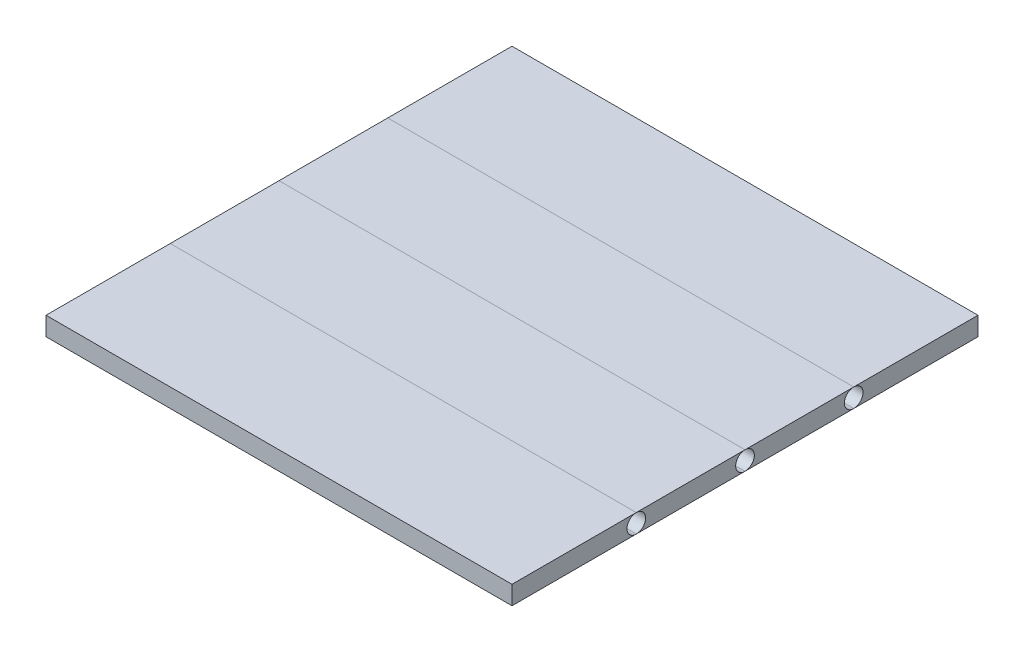
ISO-10303-21;
HEADER;
FILE_DESCRIPTION(('STEP AP214'),'2;1');
FILE_NAME('part.step','',(''),(''),'','','');
FILE_SCHEMA(('AUTOMOTIVE_DESIGN { 1 0 10303 214 1 1 1 1 }'));
ENDSEC;
DATA;
#1=APPLICATION_CONTEXT('core data for automotive mechanical design processes');
#2=APPLICATION_PROTOCOL_DEFINITION('international standard','automotive_design',2000,#1);
#3=PRODUCT_CONTEXT('',#1,'mechanical');
#4=PRODUCT('Part','Part','',(#3));
#5=PRODUCT_RELATED_PRODUCT_CATEGORY('part','',(#4));
#6=PRODUCT_DEFINITION_FORMATION('','',#4);
#7=PRODUCT_DEFINITION_CONTEXT('part definition',#1,'design');
#8=PRODUCT_DEFINITION('design','',#6,#7);
#9=PRODUCT_DEFINITION_SHAPE('','',#8);
#10=(LENGTH_UNIT() NAMED_UNIT(*) SI_UNIT(.MILLI.,.METRE.));
#11=(NAMED_UNIT(*) PLANE_ANGLE_UNIT() SI_UNIT($,.RADIAN.));
#12=(NAMED_UNIT(*) SI_UNIT($,.STERADIAN.) SOLID_ANGLE_UNIT());
#13=UNCERTAINTY_MEASURE_WITH_UNIT(LENGTH_MEASURE(1.E-05),#10,'distance_accuracy_value','');
#14=(GEOMETRIC_REPRESENTATION_CONTEXT(3) GLOBAL_UNCERTAINTY_ASSIGNED_CONTEXT((#13)) GLOBAL_UNIT_ASSIGNED_CONTEXT((#10,
#11,#12)) REPRESENTATION_CONTEXT('',''));
#15=CARTESIAN_POINT('',(0.,0.,0.));
#16=DIRECTION('',(0.,0.,1.));
#17=DIRECTION('',(1.,0.,0.));
#18=AXIS2_PLACEMENT_3D('',#15,#16,#17);
#19=CARTESIAN_POINT('',(-150.,12.,-150.));
#20=DIRECTION('',(1.,0.,0.));
#21=DIRECTION('',(0.,0.,-1.));
#22=AXIS2_PLACEMENT_3D('',#19,#20,#21);
#23=PLANE('',#22);
#24=DIRECTION('',(0.,0.,1.));
#25=VECTOR('',#24,1.);
#26=CARTESIAN_POINT('',(-150.,12.,-150.));
#27=LINE('',#26,#25);
#28=CARTESIAN_POINT('',(-150.,12.,70.));
#29=VERTEX_POINT('',#28);
#30=CARTESIAN_POINT('',(-150.,12.,150.));
#31=VERTEX_POINT('',#30);
#32=EDGE_CURVE('P0_E21',#29,#31,#27,.T.);
#33=ORIENTED_EDGE('',*,*,#32,.F.);
#34=CARTESIAN_POINT('',(-150.,5.99999999999951,70.));
#35=DIRECTION('',(1.,0.,0.));
#36=DIRECTION('',(0.,0.,-1.));
#37=AXIS2_PLACEMENT_3D('',#34,#35,#36);
#38=CIRCLE('',#37,6.);
#39=CARTESIAN_POINT('',(-150.,0.,70.));
#40=VERTEX_POINT('',#39);
#41=EDGE_CURVE('P0_E35',#29,#40,#38,.T.);
#42=ORIENTED_EDGE('',*,*,#41,.T.);
#43=DIRECTION('',(0.,0.,1.));
#44=VECTOR('',#43,1.);
#45=CARTESIAN_POINT('',(-150.,0.,-150.));
#46=LINE('',#45,#44);
#47=CARTESIAN_POINT('',(-150.,0.,150.));
#48=VERTEX_POINT('',#47);
#49=EDGE_CURVE('P0_E68',#40,#48,#46,.T.);
#50=ORIENTED_EDGE('',*,*,#49,.T.);
#51=DIRECTION('',(0.,-1.,0.));
#52=VECTOR('',#51,1.);
#53=CARTESIAN_POINT('',(-150.,12.,150.));
#54=LINE('',#53,#52);
#55=EDGE_CURVE('P0_E66',#31,#48,#54,.T.);
#56=ORIENTED_EDGE('',*,*,#55,.F.);
#57=EDGE_LOOP('',(#33,#42,#50,#56));
#58=FACE_BOUND('',#57,.T.);
#59=ADVANCED_FACE('P0_F17',(#58),#23,.F.);
#60=CARTESIAN_POINT('',(150.,12.,-150.));
#61=DIRECTION('',(-1.,0.,0.));
#62=DIRECTION('',(0.,0.,1.));
#63=AXIS2_PLACEMENT_3D('',#60,#61,#62);
#64=PLANE('',#63);
#65=DIRECTION('',(0.,0.,-1.));
#66=VECTOR('',#65,1.);
#67=CARTESIAN_POINT('',(150.,0.,-150.));
#68=LINE('',#67,#66);
#69=CARTESIAN_POINT('',(150.,0.,150.));
#70=VERTEX_POINT('',#69);
#71=CARTESIAN_POINT('',(150.,0.,70.));
#72=VERTEX_POINT('',#71);
#73=EDGE_CURVE('P0_E89',#70,#72,#68,.T.);
#74=ORIENTED_EDGE('',*,*,#73,.T.);
#75=CARTESIAN_POINT('',(150.,5.99999999999951,70.));
#76=DIRECTION('',(1.,0.,0.));
#77=DIRECTION('',(0.,0.,-1.));
#78=AXIS2_PLACEMENT_3D('',#75,#76,#77);
#79=CIRCLE('',#78,6.);
#80=CARTESIAN_POINT('',(150.,12.,70.));
#81=VERTEX_POINT('',#80);
#82=EDGE_CURVE('P0_E11',#81,#72,#79,.T.);
#83=ORIENTED_EDGE('',*,*,#82,.F.);
#84=DIRECTION('',(0.,0.,-1.));
#85=VECTOR('',#84,1.);
#86=CARTESIAN_POINT('',(150.,12.,-150.));
#87=LINE('',#86,#85);
#88=CARTESIAN_POINT('',(150.,12.,150.));
#89=VERTEX_POINT('',#88);
#90=EDGE_CURVE('P0_E79',#89,#81,#87,.T.);
#91=ORIENTED_EDGE('',*,*,#90,.F.);
#92=DIRECTION('',(0.,-1.,0.));
#93=VECTOR('',#92,1.);
#94=CARTESIAN_POINT('',(150.,12.,150.));
#95=LINE('',#94,#93);
#96=EDGE_CURVE('P0_E76',#89,#70,#95,.T.);
#97=ORIENTED_EDGE('',*,*,#96,.T.);
#98=EDGE_LOOP('',(#74,#83,#91,#97));
#99=FACE_BOUND('',#98,.T.);
#100=ADVANCED_FACE('P0_F99',(#99),#64,.F.);
#101=CARTESIAN_POINT('',(-150.,12.,150.));
#102=DIRECTION('',(0.,0.,-1.));
#103=DIRECTION('',(-1.,0.,0.));
#104=AXIS2_PLACEMENT_3D('',#101,#102,#103);
#105=PLANE('',#104);
#106=DIRECTION('',(1.,0.,0.));
#107=VECTOR('',#106,1.);
#108=CARTESIAN_POINT('',(-150.,0.,150.));
#109=LINE('',#108,#107);
#110=EDGE_CURVE('P0_E72',#48,#70,#109,.T.);
#111=ORIENTED_EDGE('',*,*,#110,.T.);
#112=ORIENTED_EDGE('',*,*,#96,.F.);
#113=DIRECTION('',(1.,0.,0.));
#114=VECTOR('',#113,1.);
#115=CARTESIAN_POINT('',(-150.,12.,150.));
#116=LINE('',#115,#114);
#117=EDGE_CURVE('P0_E62',#31,#89,#116,.T.);
#118=ORIENTED_EDGE('',*,*,#117,.F.);
#119=ORIENTED_EDGE('',*,*,#55,.T.);
#120=EDGE_LOOP('',(#111,#112,#118,#119));
#121=FACE_BOUND('',#120,.T.);
#122=ADVANCED_FACE('P0_F74',(#121),#105,.F.);
#123=CARTESIAN_POINT('',(0.,12.,0.));
#124=DIRECTION('',(0.,1.,0.));
#125=DIRECTION('',(0.,0.,1.));
#126=AXIS2_PLACEMENT_3D('',#123,#124,#125);
#127=PLANE('',#126);
#128=DIRECTION('',(1.,0.,0.));
#129=VECTOR('',#128,1.);
#130=CARTESIAN_POINT('',(-150.,11.9999999999998,70.));
#131=LINE('',#130,#129);
#132=EDGE_CURVE('P0_E27',#29,#81,#131,.T.);
#133=ORIENTED_EDGE('',*,*,#132,.F.);
#134=ORIENTED_EDGE('',*,*,#32,.T.);
#135=ORIENTED_EDGE('',*,*,#117,.T.);
#136=ORIENTED_EDGE('',*,*,#90,.T.);
#137=EDGE_LOOP('',(#133,#134,#135,#136));
#138=FACE_BOUND('',#137,.T.);
#139=ADVANCED_FACE('P0_F59',(#138),#127,.T.);
#140=CARTESIAN_POINT('',(0.,0.,0.));
#141=DIRECTION('',(0.,1.,0.));
#142=DIRECTION('',(0.,0.,1.));
#143=AXIS2_PLACEMENT_3D('',#140,#141,#142);
#144=PLANE('',#143);
#145=ORIENTED_EDGE('',*,*,#49,.F.);
#146=DIRECTION('',(1.,0.,0.));
#147=VECTOR('',#146,1.);
#148=CARTESIAN_POINT('',(-150.,-2.46330733588707E-13,70.));
#149=LINE('',#148,#147);
#150=EDGE_CURVE('P0_E40',#40,#72,#149,.T.);
#151=ORIENTED_EDGE('',*,*,#150,.T.);
#152=ORIENTED_EDGE('',*,*,#73,.F.);
#153=ORIENTED_EDGE('',*,*,#110,.F.);
#154=EDGE_LOOP('',(#145,#151,#152,#153));
#155=FACE_BOUND('',#154,.T.);
#156=ADVANCED_FACE('P0_F102',(#155),#144,.F.);
#157=CARTESIAN_POINT('',(-150.,5.99999999999951,70.));
#158=DIRECTION('',(1.,0.,0.));
#159=DIRECTION('',(0.,0.,-1.));
#160=AXIS2_PLACEMENT_3D('',#157,#158,#159);
#161=CYLINDRICAL_SURFACE('',#160,6.);
#162=ORIENTED_EDGE('',*,*,#132,.T.);
#163=ORIENTED_EDGE('',*,*,#82,.T.);
#164=ORIENTED_EDGE('',*,*,#150,.F.);
#165=ORIENTED_EDGE('',*,*,#41,.F.);
#166=EDGE_LOOP('',(#162,#163,#164,#165));
#167=FACE_BOUND('',#166,.T.);
#168=ADVANCED_FACE('P0_F19',(#167),#161,.F.);
#169=CLOSED_SHELL('',(#59,#100,#122,#139,#156,#168));
#170=MANIFOLD_SOLID_BREP('P0_B1',#169);
#171=CARTESIAN_POINT('',(-150.,12.,-150.));
#172=DIRECTION('',(0.,0.,1.));
#173=DIRECTION('',(1.,0.,0.));
#174=AXIS2_PLACEMENT_3D('',#171,#172,#173);
#175=PLANE('',#174);
#176=DIRECTION('',(-1.,0.,0.));
#177=VECTOR('',#176,1.);
#178=CARTESIAN_POINT('',(-150.,0.,-150.));
#179=LINE('',#178,#177);
#180=CARTESIAN_POINT('',(150.,0.,-150.));
#181=VERTEX_POINT('',#180);
#182=CARTESIAN_POINT('',(-150.,0.,-150.));
#183=VERTEX_POINT('',#182);
#184=EDGE_CURVE('P1_E75',#181,#183,#179,.T.);
#185=ORIENTED_EDGE('',*,*,#184,.T.);
#186=DIRECTION('',(0.,-1.,0.));
#187=VECTOR('',#186,1.);
#188=CARTESIAN_POINT('',(-150.,12.,-150.));
#189=LINE('',#188,#187);
#190=CARTESIAN_POINT('',(-150.,12.,-150.));
#191=VERTEX_POINT('',#190);
#192=EDGE_CURVE('P1_E80',#191,#183,#189,.T.);
#193=ORIENTED_EDGE('',*,*,#192,.F.);
#194=DIRECTION('',(-1.,0.,0.));
#195=VECTOR('',#194,1.);
#196=CARTESIAN_POINT('',(-150.,12.,-150.));
#197=LINE('',#196,#195);
#198=CARTESIAN_POINT('',(150.,12.,-150.));
#199=VERTEX_POINT('',#198);
#200=EDGE_CURVE('P1_E70',#199,#191,#197,.T.);
#201=ORIENTED_EDGE('',*,*,#200,.F.);
#202=DIRECTION('',(0.,-1.,0.));
#203=VECTOR('',#202,1.);
#204=CARTESIAN_POINT('',(150.,12.,-150.));
#205=LINE('',#204,#203);
#206=EDGE_CURVE('P1_E25',#199,#181,#205,.T.);
#207=ORIENTED_EDGE('',*,*,#206,.T.);
#208=EDGE_LOOP('',(#185,#193,#201,#207));
#209=FACE_BOUND('',#208,.T.);
#210=ADVANCED_FACE('P1_F17',(#209),#175,.F.);
#211=CARTESIAN_POINT('',(0.,12.,0.));
#212=DIRECTION('',(0.,1.,0.));
#213=DIRECTION('',(0.,0.,1.));
#214=AXIS2_PLACEMENT_3D('',#211,#212,#213);
#215=PLANE('',#214);
#216=DIRECTION('',(0.,0.,1.));
#217=VECTOR('',#216,1.);
#218=CARTESIAN_POINT('',(-150.,12.,-150.));
#219=LINE('',#218,#217);
#220=CARTESIAN_POINT('',(-150.,12.,-70.));
#221=VERTEX_POINT('',#220);
#222=EDGE_CURVE('P1_E64',#191,#221,#219,.T.);
#223=ORIENTED_EDGE('',*,*,#222,.T.);
#224=DIRECTION('',(1.,0.,0.));
#225=VECTOR('',#224,1.);
#226=CARTESIAN_POINT('',(-150.,12.0000000000005,-70.));
#227=LINE('',#226,#225);
#228=CARTESIAN_POINT('',(150.,12.,-70.));
#229=VERTEX_POINT('',#228);
#230=EDGE_CURVE('P1_E32',#221,#229,#227,.T.);
#231=ORIENTED_EDGE('',*,*,#230,.T.);
#232=DIRECTION('',(0.,0.,-1.));
#233=VECTOR('',#232,1.);
#234=CARTESIAN_POINT('',(150.,12.,-150.));
#235=LINE('',#234,#233);
#236=EDGE_CURVE('P1_E61',#229,#199,#235,.T.);
#237=ORIENTED_EDGE('',*,*,#236,.T.);
#238=ORIENTED_EDGE('',*,*,#200,.T.);
#239=EDGE_LOOP('',(#223,#231,#237,#238));
#240=FACE_BOUND('',#239,.T.);
#241=ADVANCED_FACE('P1_F60',(#240),#215,.T.);
#242=CARTESIAN_POINT('',(0.,0.,0.));
#243=DIRECTION('',(0.,1.,0.));
#244=DIRECTION('',(0.,0.,1.));
#245=AXIS2_PLACEMENT_3D('',#242,#243,#244);
#246=PLANE('',#245);
#247=DIRECTION('',(1.,0.,0.));
#248=VECTOR('',#247,1.);
#249=CARTESIAN_POINT('',(-150.,4.87457296749483E-13,-70.));
#250=LINE('',#249,#248);
#251=CARTESIAN_POINT('',(-150.,0.,-70.));
#252=VERTEX_POINT('',#251);
#253=CARTESIAN_POINT('',(150.,0.,-70.));
#254=VERTEX_POINT('',#253);
#255=EDGE_CURVE('P1_E11',#252,#254,#250,.T.);
#256=ORIENTED_EDGE('',*,*,#255,.F.);
#257=DIRECTION('',(0.,0.,1.));
#258=VECTOR('',#257,1.);
#259=CARTESIAN_POINT('',(-150.,0.,-150.));
#260=LINE('',#259,#258);
#261=EDGE_CURVE('P1_E71',#183,#252,#260,.T.);
#262=ORIENTED_EDGE('',*,*,#261,.F.);
#263=ORIENTED_EDGE('',*,*,#184,.F.);
#264=DIRECTION('',(0.,0.,-1.));
#265=VECTOR('',#264,1.);
#266=CARTESIAN_POINT('',(150.,0.,-150.));
#267=LINE('',#266,#265);
#268=EDGE_CURVE('P1_E66',#254,#181,#267,.T.);
#269=ORIENTED_EDGE('',*,*,#268,.F.);
#270=EDGE_LOOP('',(#256,#262,#263,#269));
#271=FACE_BOUND('',#270,.T.);
#272=ADVANCED_FACE('P1_F91',(#271),#246,.F.);
#273=CARTESIAN_POINT('',(-150.,12.,-150.));
#274=DIRECTION('',(1.,0.,0.));
#275=DIRECTION('',(0.,0.,-1.));
#276=AXIS2_PLACEMENT_3D('',#273,#274,#275);
#277=PLANE('',#276);
#278=ORIENTED_EDGE('',*,*,#261,.T.);
#279=CARTESIAN_POINT('',(-150.,6.00000000000098,-70.));
#280=DIRECTION('',(1.,0.,0.));
#281=DIRECTION('',(0.,0.,-1.));
#282=AXIS2_PLACEMENT_3D('',#279,#280,#281);
#283=CIRCLE('',#282,6.);
#284=EDGE_CURVE('P1_E57',#252,#221,#283,.T.);
#285=ORIENTED_EDGE('',*,*,#284,.T.);
#286=ORIENTED_EDGE('',*,*,#222,.F.);
#287=ORIENTED_EDGE('',*,*,#192,.T.);
#288=EDGE_LOOP('',(#278,#285,#286,#287));
#289=FACE_BOUND('',#288,.T.);
#290=ADVANCED_FACE('P1_F89',(#289),#277,.F.);
#291=CARTESIAN_POINT('',(150.,12.,-150.));
#292=DIRECTION('',(-1.,0.,0.));
#293=DIRECTION('',(0.,0.,1.));
#294=AXIS2_PLACEMENT_3D('',#291,#292,#293);
#295=PLANE('',#294);
#296=ORIENTED_EDGE('',*,*,#236,.F.);
#297=CARTESIAN_POINT('',(150.,6.00000000000098,-70.));
#298=DIRECTION('',(1.,0.,0.));
#299=DIRECTION('',(0.,0.,-1.));
#300=AXIS2_PLACEMENT_3D('',#297,#298,#299);
#301=CIRCLE('',#300,6.);
#302=EDGE_CURVE('P1_E53',#254,#229,#301,.T.);
#303=ORIENTED_EDGE('',*,*,#302,.F.);
#304=ORIENTED_EDGE('',*,*,#268,.T.);
#305=ORIENTED_EDGE('',*,*,#206,.F.);
#306=EDGE_LOOP('',(#296,#303,#304,#305));
#307=FACE_BOUND('',#306,.T.);
#308=ADVANCED_FACE('P1_F19',(#307),#295,.F.);
#309=CARTESIAN_POINT('',(-150.,6.00000000000098,-70.));
#310=DIRECTION('',(1.,0.,0.));
#311=DIRECTION('',(0.,0.,-1.));
#312=AXIS2_PLACEMENT_3D('',#309,#310,#311);
#313=CYLINDRICAL_SURFACE('',#312,6.);
#314=ORIENTED_EDGE('',*,*,#284,.F.);
#315=ORIENTED_EDGE('',*,*,#255,.T.);
#316=ORIENTED_EDGE('',*,*,#302,.T.);
#317=ORIENTED_EDGE('',*,*,#230,.F.);
#318=EDGE_LOOP('',(#314,#315,#316,#317));
#319=FACE_BOUND('',#318,.T.);
#320=ADVANCED_FACE('P1_F54',(#319),#313,.F.);
#321=CLOSED_SHELL('',(#210,#241,#272,#290,#308,#320));
#322=MANIFOLD_SOLID_BREP('P1_B1',#321);
#323=CARTESIAN_POINT('',(0.,0.,0.));
#324=DIRECTION('',(0.,1.,0.));
#325=DIRECTION('',(0.,0.,1.));
#326=AXIS2_PLACEMENT_3D('',#323,#324,#325);
#327=PLANE('',#326);
#328=DIRECTION('',(0.,0.,1.));
#329=VECTOR('',#328,1.);
#330=CARTESIAN_POINT('',(-150.,0.,-150.));
#331=LINE('',#330,#329);
#332=CARTESIAN_POINT('',(-150.,0.,-70.));
#333=VERTEX_POINT('',#332);
#334=CARTESIAN_POINT('',(-150.,0.,0.));
#335=VERTEX_POINT('',#334);
#336=EDGE_CURVE('P2_E79',#333,#335,#331,.T.);
#337=ORIENTED_EDGE('',*,*,#336,.F.);
#338=DIRECTION('',(1.,0.,0.));
#339=VECTOR('',#338,1.);
#340=CARTESIAN_POINT('',(-150.,4.87457296749483E-13,-70.));
#341=LINE('',#340,#339);
#342=CARTESIAN_POINT('',(150.,0.,-70.));
#343=VERTEX_POINT('',#342);
#344=EDGE_CURVE('P2_E88',#333,#343,#341,.T.);
#345=ORIENTED_EDGE('',*,*,#344,.T.);
#346=DIRECTION('',(0.,0.,-1.));
#347=VECTOR('',#346,1.);
#348=CARTESIAN_POINT('',(150.,0.,-150.));
#349=LINE('',#348,#347);
#350=CARTESIAN_POINT('',(150.,0.,0.));
#351=VERTEX_POINT('',#350);
#352=EDGE_CURVE('P2_E70',#351,#343,#349,.T.);
#353=ORIENTED_EDGE('',*,*,#352,.F.);
#354=DIRECTION('',(1.,0.,0.));
#355=VECTOR('',#354,1.);
#356=CARTESIAN_POINT('',(-150.,0.,0.));
#357=LINE('',#356,#355);
#358=EDGE_CURVE('P2_E74',#335,#351,#357,.T.);
#359=ORIENTED_EDGE('',*,*,#358,.F.);
#360=EDGE_LOOP('',(#337,#345,#353,#359));
#361=FACE_BOUND('',#360,.T.);
#362=ADVANCED_FACE('P2_F17',(#361),#327,.F.);
#363=CARTESIAN_POINT('',(0.,12.,0.));
#364=DIRECTION('',(0.,1.,0.));
#365=DIRECTION('',(0.,0.,1.));
#366=AXIS2_PLACEMENT_3D('',#363,#364,#365);
#367=PLANE('',#366);
#368=DIRECTION('',(1.,0.,0.));
#369=VECTOR('',#368,1.);
#370=CARTESIAN_POINT('',(-150.,12.0000000000005,-70.));
#371=LINE('',#370,#369);
#372=CARTESIAN_POINT('',(-150.,12.,-70.));
#373=VERTEX_POINT('',#372);
#374=CARTESIAN_POINT('',(150.,12.,-70.));
#375=VERTEX_POINT('',#374);
#376=EDGE_CURVE('P2_E27',#373,#375,#371,.T.);
#377=ORIENTED_EDGE('',*,*,#376,.F.);
#378=DIRECTION('',(0.,0.,1.));
#379=VECTOR('',#378,1.);
#380=CARTESIAN_POINT('',(-150.,12.,-150.));
#381=LINE('',#380,#379);
#382=CARTESIAN_POINT('',(-150.,12.,0.));
#383=VERTEX_POINT('',#382);
#384=EDGE_CURVE('P2_E21',#373,#383,#381,.T.);
#385=ORIENTED_EDGE('',*,*,#384,.T.);
#386=DIRECTION('',(1.,0.,0.));
#387=VECTOR('',#386,1.);
#388=CARTESIAN_POINT('',(-150.,12.,0.));
#389=LINE('',#388,#387);
#390=CARTESIAN_POINT('',(150.,12.,0.));
#391=VERTEX_POINT('',#390);
#392=EDGE_CURVE('P2_E64',#383,#391,#389,.T.);
#393=ORIENTED_EDGE('',*,*,#392,.T.);
#394=DIRECTION('',(0.,0.,-1.));
#395=VECTOR('',#394,1.);
#396=CARTESIAN_POINT('',(150.,12.,-150.));
#397=LINE('',#396,#395);
#398=EDGE_CURVE('P2_E62',#391,#375,#397,.T.);
#399=ORIENTED_EDGE('',*,*,#398,.T.);
#400=EDGE_LOOP('',(#377,#385,#393,#399));
#401=FACE_BOUND('',#400,.T.);
#402=ADVANCED_FACE('P2_F63',(#401),#367,.T.);
#403=CARTESIAN_POINT('',(-150.,12.,-150.));
#404=DIRECTION('',(1.,0.,0.));
#405=DIRECTION('',(0.,0.,-1.));
#406=AXIS2_PLACEMENT_3D('',#403,#404,#405);
#407=PLANE('',#406);
#408=ORIENTED_EDGE('',*,*,#384,.F.);
#409=CARTESIAN_POINT('',(-150.,6.00000000000098,-70.));
#410=DIRECTION('',(1.,0.,0.));
#411=DIRECTION('',(0.,0.,-1.));
#412=AXIS2_PLACEMENT_3D('',#409,#410,#411);
#413=CIRCLE('',#412,6.);
#414=EDGE_CURVE('P2_E35',#373,#333,#413,.T.);
#415=ORIENTED_EDGE('',*,*,#414,.T.);
#416=ORIENTED_EDGE('',*,*,#336,.T.);
#417=CARTESIAN_POINT('',(-150.,6.,0.));
#418=DIRECTION('',(1.,0.,0.));
#419=DIRECTION('',(0.,0.,-1.));
#420=AXIS2_PLACEMENT_3D('',#417,#418,#419);
#421=CIRCLE('',#420,6.);
#422=EDGE_CURVE('P2_E75',#335,#383,#421,.T.);
#423=ORIENTED_EDGE('',*,*,#422,.T.);
#424=EDGE_LOOP('',(#408,#415,#416,#423));
#425=FACE_BOUND('',#424,.T.);
#426=ADVANCED_FACE('P2_F90',(#425),#407,.F.);
#427=CARTESIAN_POINT('',(150.,12.,-150.));
#428=DIRECTION('',(-1.,0.,0.));
#429=DIRECTION('',(0.,0.,1.));
#430=AXIS2_PLACEMENT_3D('',#427,#428,#429);
#431=PLANE('',#430);
#432=ORIENTED_EDGE('',*,*,#352,.T.);
#433=CARTESIAN_POINT('',(150.,6.00000000000098,-70.));
#434=DIRECTION('',(1.,0.,0.));
#435=DIRECTION('',(0.,0.,-1.));
#436=AXIS2_PLACEMENT_3D('',#433,#434,#435);
#437=CIRCLE('',#436,6.);
#438=EDGE_CURVE('P2_E11',#375,#343,#437,.T.);
#439=ORIENTED_EDGE('',*,*,#438,.F.);
#440=ORIENTED_EDGE('',*,*,#398,.F.);
#441=CARTESIAN_POINT('',(150.,6.,0.));
#442=DIRECTION('',(1.,0.,0.));
#443=DIRECTION('',(0.,0.,-1.));
#444=AXIS2_PLACEMENT_3D('',#441,#442,#443);
#445=CIRCLE('',#444,6.);
#446=EDGE_CURVE('P2_E58',#351,#391,#445,.T.);
#447=ORIENTED_EDGE('',*,*,#446,.F.);
#448=EDGE_LOOP('',(#432,#439,#440,#447));
#449=FACE_BOUND('',#448,.T.);
#450=ADVANCED_FACE('P2_F68',(#449),#431,.F.);
#451=CARTESIAN_POINT('',(-150.,6.,0.));
#452=DIRECTION('',(1.,0.,0.));
#453=DIRECTION('',(0.,0.,-1.));
#454=AXIS2_PLACEMENT_3D('',#451,#452,#453);
#455=CYLINDRICAL_SURFACE('',#454,6.);
#456=ORIENTED_EDGE('',*,*,#422,.F.);
#457=ORIENTED_EDGE('',*,*,#358,.T.);
#458=ORIENTED_EDGE('',*,*,#446,.T.);
#459=ORIENTED_EDGE('',*,*,#392,.F.);
#460=EDGE_LOOP('',(#456,#457,#458,#459));
#461=FACE_BOUND('',#460,.T.);
#462=ADVANCED_FACE('P2_F19',(#461),#455,.F.);
#463=CARTESIAN_POINT('',(-150.,6.00000000000098,-70.));
#464=DIRECTION('',(1.,0.,0.));
#465=DIRECTION('',(0.,0.,-1.));
#466=AXIS2_PLACEMENT_3D('',#463,#464,#465);
#467=CYLINDRICAL_SURFACE('',#466,6.);
#468=ORIENTED_EDGE('',*,*,#376,.T.);
#469=ORIENTED_EDGE('',*,*,#438,.T.);
#470=ORIENTED_EDGE('',*,*,#344,.F.);
#471=ORIENTED_EDGE('',*,*,#414,.F.);
#472=EDGE_LOOP('',(#468,#469,#470,#471));
#473=FACE_BOUND('',#472,.T.);
#474=ADVANCED_FACE('P2_F52',(#473),#467,.F.);
#475=CLOSED_SHELL('',(#362,#402,#426,#450,#462,#474));
#476=MANIFOLD_SOLID_BREP('P2_B1',#475);
#477=CARTESIAN_POINT('',(0.,12.,0.));
#478=DIRECTION('',(0.,1.,0.));
#479=DIRECTION('',(0.,0.,1.));
#480=AXIS2_PLACEMENT_3D('',#477,#478,#479);
#481=PLANE('',#480);
#482=DIRECTION('',(0.,0.,1.));
#483=VECTOR('',#482,1.);
#484=CARTESIAN_POINT('',(-150.,12.,-150.));
#485=LINE('',#484,#483);
#486=CARTESIAN_POINT('',(-150.,12.,0.));
#487=VERTEX_POINT('',#486);
#488=CARTESIAN_POINT('',(-150.,12.,70.));
#489=VERTEX_POINT('',#488);
#490=EDGE_CURVE('P3_E21',#487,#489,#485,.T.);
#491=ORIENTED_EDGE('',*,*,#490,.T.);
#492=DIRECTION('',(1.,0.,0.));
#493=VECTOR('',#492,1.);
#494=CARTESIAN_POINT('',(-150.,11.9999999999998,70.));
#495=LINE('',#494,#493);
#496=CARTESIAN_POINT('',(150.,12.,70.));
#497=VERTEX_POINT('',#496);
#498=EDGE_CURVE('P3_E35',#489,#497,#495,.T.);
#499=ORIENTED_EDGE('',*,*,#498,.T.);
#500=DIRECTION('',(0.,0.,-1.));
#501=VECTOR('',#500,1.);
#502=CARTESIAN_POINT('',(150.,12.,-150.));
#503=LINE('',#502,#501);
#504=CARTESIAN_POINT('',(150.,12.,0.));
#505=VERTEX_POINT('',#504);
#506=EDGE_CURVE('P3_E75',#497,#505,#503,.T.);
#507=ORIENTED_EDGE('',*,*,#506,.T.);
#508=DIRECTION('',(1.,0.,0.));
#509=VECTOR('',#508,1.);
#510=CARTESIAN_POINT('',(-150.,12.,0.));
#511=LINE('',#510,#509);
#512=EDGE_CURVE('P3_E60',#487,#505,#511,.T.);
#513=ORIENTED_EDGE('',*,*,#512,.F.);
#514=EDGE_LOOP('',(#491,#499,#507,#513));
#515=FACE_BOUND('',#514,.T.);
#516=ADVANCED_FACE('P3_F17',(#515),#481,.T.);
#517=CARTESIAN_POINT('',(0.,0.,0.));
#518=DIRECTION('',(0.,1.,0.));
#519=DIRECTION('',(0.,0.,1.));
#520=AXIS2_PLACEMENT_3D('',#517,#518,#519);
#521=PLANE('',#520);
#522=DIRECTION('',(1.,0.,0.));
#523=VECTOR('',#522,1.);
#524=CARTESIAN_POINT('',(-150.,-2.46330733588707E-13,70.));
#525=LINE('',#524,#523);
#526=CARTESIAN_POINT('',(-150.,0.,70.));
#527=VERTEX_POINT('',#526);
#528=CARTESIAN_POINT('',(150.,0.,70.));
#529=VERTEX_POINT('',#528);
#530=EDGE_CURVE('P3_E27',#527,#529,#525,.T.);
#531=ORIENTED_EDGE('',*,*,#530,.F.);
#532=DIRECTION('',(0.,0.,1.));
#533=VECTOR('',#532,1.);
#534=CARTESIAN_POINT('',(-150.,0.,-150.));
#535=LINE('',#534,#533);
#536=CARTESIAN_POINT('',(-150.,0.,0.));
#537=VERTEX_POINT('',#536);
#538=EDGE_CURVE('P3_E73',#537,#527,#535,.T.);
#539=ORIENTED_EDGE('',*,*,#538,.F.);
#540=DIRECTION('',(1.,0.,0.));
#541=VECTOR('',#540,1.);
#542=CARTESIAN_POINT('',(-150.,0.,0.));
#543=LINE('',#542,#541);
#544=CARTESIAN_POINT('',(150.,0.,0.));
#545=VERTEX_POINT('',#544);
#546=EDGE_CURVE('P3_E57',#537,#545,#543,.T.);
#547=ORIENTED_EDGE('',*,*,#546,.T.);
#548=DIRECTION('',(0.,0.,-1.));
#549=VECTOR('',#548,1.);
#550=CARTESIAN_POINT('',(150.,0.,-150.));
#551=LINE('',#550,#549);
#552=EDGE_CURVE('P3_E70',#529,#545,#551,.T.);
#553=ORIENTED_EDGE('',*,*,#552,.F.);
#554=EDGE_LOOP('',(#531,#539,#547,#553));
#555=FACE_BOUND('',#554,.T.);
#556=ADVANCED_FACE('P3_F69',(#555),#521,.F.);
#557=CARTESIAN_POINT('',(-150.,12.,-150.));
#558=DIRECTION('',(1.,0.,0.));
#559=DIRECTION('',(0.,0.,-1.));
#560=AXIS2_PLACEMENT_3D('',#557,#558,#559);
#561=PLANE('',#560);
#562=ORIENTED_EDGE('',*,*,#538,.T.);
#563=CARTESIAN_POINT('',(-150.,5.99999999999951,70.));
#564=DIRECTION('',(1.,0.,0.));
#565=DIRECTION('',(0.,0.,-1.));
#566=AXIS2_PLACEMENT_3D('',#563,#564,#565);
#567=CIRCLE('',#566,6.);
#568=EDGE_CURVE('P3_E81',#527,#489,#567,.T.);
#569=ORIENTED_EDGE('',*,*,#568,.T.);
#570=ORIENTED_EDGE('',*,*,#490,.F.);
#571=CARTESIAN_POINT('',(-150.,6.,0.));
#572=DIRECTION('',(1.,0.,0.));
#573=DIRECTION('',(0.,0.,-1.));
#574=AXIS2_PLACEMENT_3D('',#571,#572,#573);
#575=CIRCLE('',#574,6.);
#576=EDGE_CURVE('P3_E78',#487,#537,#575,.T.);
#577=ORIENTED_EDGE('',*,*,#576,.T.);
#578=EDGE_LOOP('',(#562,#569,#570,#577));
#579=FACE_BOUND('',#578,.T.);
#580=ADVANCED_FACE('P3_F90',(#579),#561,.F.);
#581=CARTESIAN_POINT('',(150.,12.,-150.));
#582=DIRECTION('',(-1.,0.,0.));
#583=DIRECTION('',(0.,0.,1.));
#584=AXIS2_PLACEMENT_3D('',#581,#582,#583);
#585=PLANE('',#584);
#586=ORIENTED_EDGE('',*,*,#506,.F.);
#587=CARTESIAN_POINT('',(150.,5.99999999999951,70.));
#588=DIRECTION('',(1.,0.,0.));
#589=DIRECTION('',(0.,0.,-1.));
#590=AXIS2_PLACEMENT_3D('',#587,#588,#589);
#591=CIRCLE('',#590,6.);
#592=EDGE_CURVE('P3_E11',#529,#497,#591,.T.);
#593=ORIENTED_EDGE('',*,*,#592,.F.);
#594=ORIENTED_EDGE('',*,*,#552,.T.);
#595=CARTESIAN_POINT('',(150.,6.,0.));
#596=DIRECTION('',(1.,0.,0.));
#597=DIRECTION('',(0.,0.,-1.));
#598=AXIS2_PLACEMENT_3D('',#595,#596,#597);
#599=CIRCLE('',#598,6.);
#600=EDGE_CURVE('P3_E53',#505,#545,#599,.T.);
#601=ORIENTED_EDGE('',*,*,#600,.F.);
#602=EDGE_LOOP('',(#586,#593,#594,#601));
#603=FACE_BOUND('',#602,.T.);
#604=ADVANCED_FACE('P3_F77',(#603),#585,.F.);
#605=CARTESIAN_POINT('',(-150.,6.,0.));
#606=DIRECTION('',(1.,0.,0.));
#607=DIRECTION('',(0.,0.,-1.));
#608=AXIS2_PLACEMENT_3D('',#605,#606,#607);
#609=CYLINDRICAL_SURFACE('',#608,6.);
#610=ORIENTED_EDGE('',*,*,#512,.T.);
#611=ORIENTED_EDGE('',*,*,#600,.T.);
#612=ORIENTED_EDGE('',*,*,#546,.F.);
#613=ORIENTED_EDGE('',*,*,#576,.F.);
#614=EDGE_LOOP('',(#610,#611,#612,#613));
#615=FACE_BOUND('',#614,.T.);
#616=ADVANCED_FACE('P3_F55',(#615),#609,.F.);
#617=CARTESIAN_POINT('',(-150.,5.99999999999951,70.));
#618=DIRECTION('',(1.,0.,0.));
#619=DIRECTION('',(0.,0.,-1.));
#620=AXIS2_PLACEMENT_3D('',#617,#618,#619);
#621=CYLINDRICAL_SURFACE('',#620,6.);
#622=ORIENTED_EDGE('',*,*,#568,.F.);
#623=ORIENTED_EDGE('',*,*,#530,.T.);
#624=ORIENTED_EDGE('',*,*,#592,.T.);
#625=ORIENTED_EDGE('',*,*,#498,.F.);
#626=EDGE_LOOP('',(#622,#623,#624,#625));
#627=FACE_BOUND('',#626,.T.);
#628=ADVANCED_FACE('P3_F19',(#627),#621,.F.);
#629=CLOSED_SHELL('',(#516,#556,#580,#604,#616,#628));
#630=MANIFOLD_SOLID_BREP('P3_B1',#629);
#631=ADVANCED_BREP_SHAPE_REPRESENTATION('',(#18,#170,#322,#476,#630),#14);
#632=SHAPE_DEFINITION_REPRESENTATION(#9,#631);
ENDSEC;
END-ISO-10303-21;
